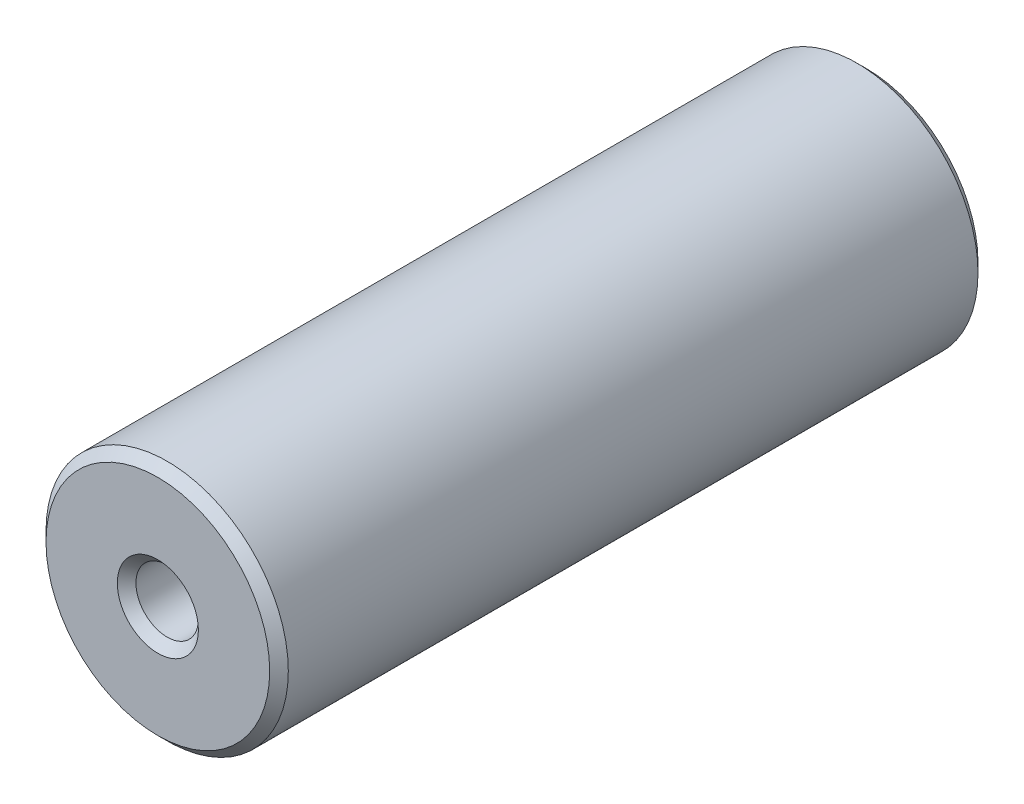
ISO-10303-21;
HEADER;
FILE_DESCRIPTION(('STEP AP214'),'2;1');
FILE_NAME('part.step','',(''),(''),'','','');
FILE_SCHEMA(('AUTOMOTIVE_DESIGN { 1 0 10303 214 1 1 1 1 }'));
ENDSEC;
DATA;
#1=APPLICATION_CONTEXT('core data for automotive mechanical design processes');
#2=APPLICATION_PROTOCOL_DEFINITION('international standard','automotive_design',2000,#1);
#3=PRODUCT_CONTEXT('',#1,'mechanical');
#4=PRODUCT('Part','Part','',(#3));
#5=PRODUCT_RELATED_PRODUCT_CATEGORY('part','',(#4));
#6=PRODUCT_DEFINITION_FORMATION('','',#4);
#7=PRODUCT_DEFINITION_CONTEXT('part definition',#1,'design');
#8=PRODUCT_DEFINITION('design','',#6,#7);
#9=PRODUCT_DEFINITION_SHAPE('','',#8);
#10=(LENGTH_UNIT() NAMED_UNIT(*) SI_UNIT(.MILLI.,.METRE.));
#11=(NAMED_UNIT(*) PLANE_ANGLE_UNIT() SI_UNIT($,.RADIAN.));
#12=(NAMED_UNIT(*) SI_UNIT($,.STERADIAN.) SOLID_ANGLE_UNIT());
#13=UNCERTAINTY_MEASURE_WITH_UNIT(LENGTH_MEASURE(1.E-05),#10,'distance_accuracy_value','');
#14=(GEOMETRIC_REPRESENTATION_CONTEXT(3) GLOBAL_UNCERTAINTY_ASSIGNED_CONTEXT((#13)) GLOBAL_UNIT_ASSIGNED_CONTEXT((#10,
#11,#12)) REPRESENTATION_CONTEXT('',''));
#15=CARTESIAN_POINT('',(0.,0.,0.));
#16=DIRECTION('',(0.,0.,1.));
#17=DIRECTION('',(1.,0.,0.));
#18=AXIS2_PLACEMENT_3D('',#15,#16,#17);
#19=CARTESIAN_POINT('',(0.,0.,76.));
#20=DIRECTION('',(0.,0.,1.));
#21=DIRECTION('',(1.,0.,0.));
#22=AXIS2_PLACEMENT_3D('',#19,#20,#21);
#23=PLANE('',#22);
#24=CARTESIAN_POINT('',(0.,0.,76.));
#25=DIRECTION('',(0.,0.,1.));
#26=DIRECTION('',(1.,0.,0.));
#27=AXIS2_PLACEMENT_3D('',#24,#25,#26);
#28=CIRCLE('',#27,4.34999999999999);
#29=CARTESIAN_POINT('',(4.34999999999999,0.,76.));
#30=VERTEX_POINT('',#29);
#31=EDGE_CURVE('E42',#30,#30,#28,.F.);
#32=ORIENTED_EDGE('',*,*,#31,.T.);
#33=EDGE_LOOP('',(#32));
#34=FACE_BOUND('',#33,.T.);
#35=CARTESIAN_POINT('',(0.,0.,76.));
#36=DIRECTION('',(0.,0.,1.));
#37=DIRECTION('',(1.,0.,0.));
#38=AXIS2_PLACEMENT_3D('',#35,#36,#37);
#39=CIRCLE('',#38,12.);
#40=CARTESIAN_POINT('',(12.,0.,76.));
#41=VERTEX_POINT('',#40);
#42=EDGE_CURVE('E46',#41,#41,#39,.T.);
#43=ORIENTED_EDGE('',*,*,#42,.T.);
#44=EDGE_LOOP('',(#43));
#45=FACE_BOUND('',#44,.T.);
#46=ADVANCED_FACE('F31',(#34,#45),#23,.T.);
#47=CARTESIAN_POINT('',(0.,0.,0.));
#48=DIRECTION('',(0.,0.,1.));
#49=DIRECTION('',(1.,0.,0.));
#50=AXIS2_PLACEMENT_3D('',#47,#48,#49);
#51=PLANE('',#50);
#52=CARTESIAN_POINT('',(0.,0.,0.));
#53=DIRECTION('',(0.,0.,1.));
#54=DIRECTION('',(1.,0.,0.));
#55=AXIS2_PLACEMENT_3D('',#52,#53,#54);
#56=CIRCLE('',#55,4.35000000000001);
#57=CARTESIAN_POINT('',(4.35000000000001,0.,0.));
#58=VERTEX_POINT('',#57);
#59=EDGE_CURVE('E57',#58,#58,#56,.T.);
#60=ORIENTED_EDGE('',*,*,#59,.T.);
#61=EDGE_LOOP('',(#60));
#62=FACE_BOUND('',#61,.T.);
#63=CARTESIAN_POINT('',(0.,0.,0.));
#64=DIRECTION('',(0.,0.,1.));
#65=DIRECTION('',(1.,0.,0.));
#66=AXIS2_PLACEMENT_3D('',#63,#64,#65);
#67=CIRCLE('',#66,12.);
#68=CARTESIAN_POINT('',(12.,0.,0.));
#69=VERTEX_POINT('',#68);
#70=EDGE_CURVE('E60',#69,#69,#67,.F.);
#71=ORIENTED_EDGE('',*,*,#70,.T.);
#72=EDGE_LOOP('',(#71));
#73=FACE_BOUND('',#72,.T.);
#74=ADVANCED_FACE('F64',(#62,#73),#51,.F.);
#75=CARTESIAN_POINT('',(0.,0.,76.));
#76=DIRECTION('',(0.,0.,-1.));
#77=DIRECTION('',(-1.,0.,0.));
#78=AXIS2_PLACEMENT_3D('',#75,#76,#77);
#79=CYLINDRICAL_SURFACE('',#78,13.);
#80=CARTESIAN_POINT('',(0.,0.,1.));
#81=DIRECTION('',(0.,0.,1.));
#82=DIRECTION('',(1.,0.,0.));
#83=AXIS2_PLACEMENT_3D('',#80,#81,#82);
#84=CIRCLE('',#83,13.);
#85=CARTESIAN_POINT('',(13.,0.,1.));
#86=VERTEX_POINT('',#85);
#87=EDGE_CURVE('E10',#86,#86,#84,.T.);
#88=ORIENTED_EDGE('',*,*,#87,.T.);
#89=EDGE_LOOP('',(#88));
#90=FACE_BOUND('',#89,.T.);
#91=CARTESIAN_POINT('',(0.,0.,75.));
#92=DIRECTION('',(0.,0.,1.));
#93=DIRECTION('',(1.,0.,0.));
#94=AXIS2_PLACEMENT_3D('',#91,#92,#93);
#95=CIRCLE('',#94,13.);
#96=CARTESIAN_POINT('',(13.,0.,75.));
#97=VERTEX_POINT('',#96);
#98=EDGE_CURVE('E38',#97,#97,#95,.F.);
#99=ORIENTED_EDGE('',*,*,#98,.T.);
#100=EDGE_LOOP('',(#99));
#101=FACE_BOUND('',#100,.T.);
#102=ADVANCED_FACE('F84',(#90,#101),#79,.T.);
#103=CARTESIAN_POINT('',(0.,0.,76.));
#104=DIRECTION('',(0.,0.,-1.));
#105=DIRECTION('',(-1.,0.,0.));
#106=AXIS2_PLACEMENT_3D('',#103,#104,#105);
#107=CYLINDRICAL_SURFACE('',#106,3.35);
#108=CARTESIAN_POINT('',(0.,0.,1.));
#109=DIRECTION('',(0.,0.,1.));
#110=DIRECTION('',(1.,0.,0.));
#111=AXIS2_PLACEMENT_3D('',#108,#109,#110);
#112=CIRCLE('',#111,3.35);
#113=CARTESIAN_POINT('',(3.35,0.,1.));
#114=VERTEX_POINT('',#113);
#115=EDGE_CURVE('E51',#114,#114,#112,.F.);
#116=ORIENTED_EDGE('',*,*,#115,.T.);
#117=EDGE_LOOP('',(#116));
#118=FACE_BOUND('',#117,.T.);
#119=CARTESIAN_POINT('',(0.,0.,75.));
#120=DIRECTION('',(0.,0.,1.));
#121=DIRECTION('',(1.,0.,0.));
#122=AXIS2_PLACEMENT_3D('',#119,#120,#121);
#123=CIRCLE('',#122,3.35);
#124=CARTESIAN_POINT('',(3.35,0.,75.));
#125=VERTEX_POINT('',#124);
#126=EDGE_CURVE('E54',#125,#125,#123,.T.);
#127=ORIENTED_EDGE('',*,*,#126,.T.);
#128=EDGE_LOOP('',(#127));
#129=FACE_BOUND('',#128,.T.);
#130=ADVANCED_FACE('F89',(#118,#129),#107,.F.);
#131=CARTESIAN_POINT('',(0.,0.,0.));
#132=DIRECTION('',(0.,0.,-1.));
#133=DIRECTION('',(-1.,0.,0.));
#134=AXIS2_PLACEMENT_3D('',#131,#132,#133);
#135=CONICAL_SURFACE('',#134,4.35000000000001,0.785398163397451);
#136=ORIENTED_EDGE('',*,*,#115,.F.);
#137=EDGE_LOOP('',(#136));
#138=FACE_BOUND('',#137,.T.);
#139=ORIENTED_EDGE('',*,*,#59,.F.);
#140=EDGE_LOOP('',(#139));
#141=FACE_BOUND('',#140,.T.);
#142=ADVANCED_FACE('F75',(#138,#141),#135,.F.);
#143=CARTESIAN_POINT('',(0.,0.,75.));
#144=DIRECTION('',(0.,0.,1.));
#145=DIRECTION('',(1.,0.,0.));
#146=AXIS2_PLACEMENT_3D('',#143,#144,#145);
#147=CONICAL_SURFACE('',#146,3.35,0.785398163397444);
#148=ORIENTED_EDGE('',*,*,#31,.F.);
#149=EDGE_LOOP('',(#148));
#150=FACE_BOUND('',#149,.T.);
#151=ORIENTED_EDGE('',*,*,#126,.F.);
#152=EDGE_LOOP('',(#151));
#153=FACE_BOUND('',#152,.T.);
#154=ADVANCED_FACE('F69',(#150,#153),#147,.F.);
#155=CARTESIAN_POINT('',(0.,0.,1.));
#156=DIRECTION('',(0.,0.,1.));
#157=DIRECTION('',(1.,0.,0.));
#158=AXIS2_PLACEMENT_3D('',#155,#156,#157);
#159=CONICAL_SURFACE('',#158,13.,0.78539816339745);
#160=ORIENTED_EDGE('',*,*,#70,.F.);
#161=EDGE_LOOP('',(#160));
#162=FACE_BOUND('',#161,.T.);
#163=ORIENTED_EDGE('',*,*,#87,.F.);
#164=EDGE_LOOP('',(#163));
#165=FACE_BOUND('',#164,.T.);
#166=ADVANCED_FACE('F66',(#162,#165),#159,.T.);
#167=CARTESIAN_POINT('',(0.,0.,76.));
#168=DIRECTION('',(0.,0.,-1.));
#169=DIRECTION('',(-1.,0.,0.));
#170=AXIS2_PLACEMENT_3D('',#167,#168,#169);
#171=CONICAL_SURFACE('',#170,12.,0.78539816339745);
#172=ORIENTED_EDGE('',*,*,#98,.F.);
#173=EDGE_LOOP('',(#172));
#174=FACE_BOUND('',#173,.T.);
#175=ORIENTED_EDGE('',*,*,#42,.F.);
#176=EDGE_LOOP('',(#175));
#177=FACE_BOUND('',#176,.T.);
#178=ADVANCED_FACE('F33',(#174,#177),#171,.T.);
#179=CLOSED_SHELL('',(#46,#74,#102,#130,#142,#154,#166,#178));
#180=MANIFOLD_SOLID_BREP('B2',#179);
#181=ADVANCED_BREP_SHAPE_REPRESENTATION('',(#18,#180),#14);
#182=SHAPE_DEFINITION_REPRESENTATION(#9,#181);
ENDSEC;
END-ISO-10303-21;
